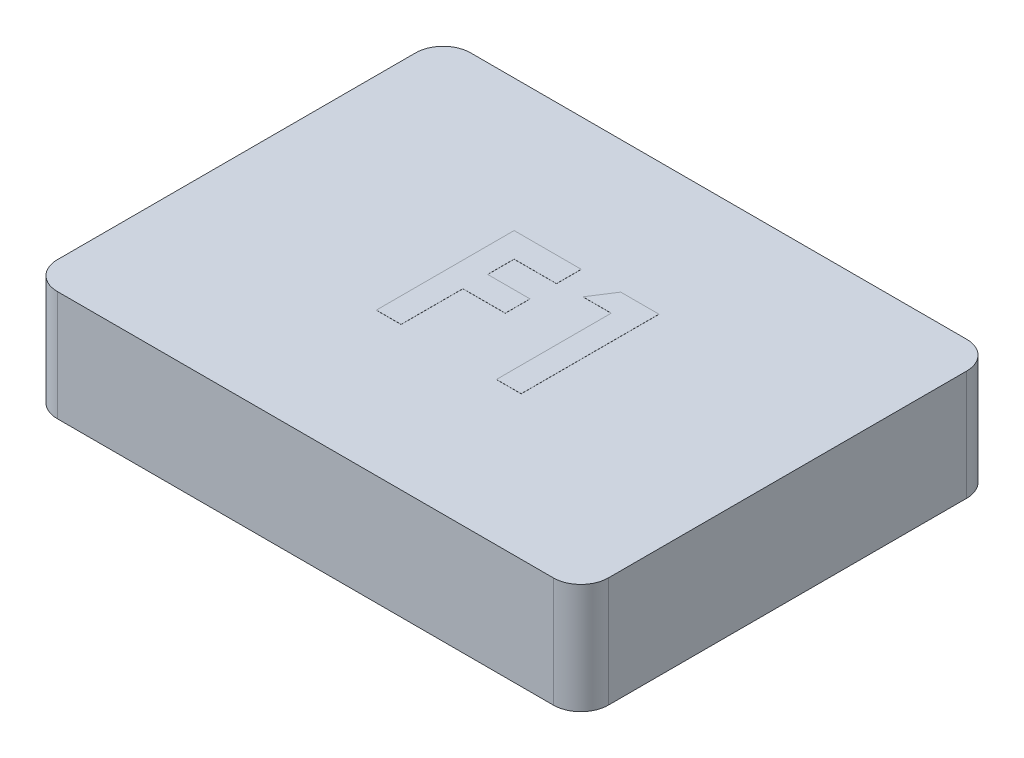
ISO-10303-21;
HEADER;
FILE_DESCRIPTION(('STEP AP214'),'2;1');
FILE_NAME('part.step','',(''),(''),'','','');
FILE_SCHEMA(('AUTOMOTIVE_DESIGN { 1 0 10303 214 1 1 1 1 }'));
ENDSEC;
DATA;
#1=APPLICATION_CONTEXT('core data for automotive mechanical design processes');
#2=APPLICATION_PROTOCOL_DEFINITION('international standard','automotive_design',2000,#1);
#3=PRODUCT_CONTEXT('',#1,'mechanical');
#4=PRODUCT('Part','Part','',(#3));
#5=PRODUCT_RELATED_PRODUCT_CATEGORY('part','',(#4));
#6=PRODUCT_DEFINITION_FORMATION('','',#4);
#7=PRODUCT_DEFINITION_CONTEXT('part definition',#1,'design');
#8=PRODUCT_DEFINITION('design','',#6,#7);
#9=PRODUCT_DEFINITION_SHAPE('','',#8);
#10=(LENGTH_UNIT() NAMED_UNIT(*) SI_UNIT(.MILLI.,.METRE.));
#11=(NAMED_UNIT(*) PLANE_ANGLE_UNIT() SI_UNIT($,.RADIAN.));
#12=(NAMED_UNIT(*) SI_UNIT($,.STERADIAN.) SOLID_ANGLE_UNIT());
#13=UNCERTAINTY_MEASURE_WITH_UNIT(LENGTH_MEASURE(1.E-05),#10,'distance_accuracy_value','');
#14=(GEOMETRIC_REPRESENTATION_CONTEXT(3) GLOBAL_UNCERTAINTY_ASSIGNED_CONTEXT((#13)) GLOBAL_UNIT_ASSIGNED_CONTEXT((#10,
#11,#12)) REPRESENTATION_CONTEXT('',''));
#15=CARTESIAN_POINT('',(0.,0.,0.));
#16=DIRECTION('',(0.,0.,1.));
#17=DIRECTION('',(1.,0.,0.));
#18=AXIS2_PLACEMENT_3D('',#15,#16,#17);
#19=CARTESIAN_POINT('',(0.,2.54,-9.525));
#20=DIRECTION('',(1.,0.,0.));
#21=DIRECTION('',(0.,0.,-1.));
#22=AXIS2_PLACEMENT_3D('',#19,#20,#21);
#23=PLANE('',#22);
#24=DIRECTION('',(0.,0.,1.));
#25=VECTOR('',#24,1.);
#26=CARTESIAN_POINT('',(0.,2.54,-9.525));
#27=LINE('',#26,#25);
#28=CARTESIAN_POINT('',(0.,2.54,-8.89));
#29=VERTEX_POINT('',#28);
#30=CARTESIAN_POINT('',(0.,2.54,-0.635000000000004));
#31=VERTEX_POINT('',#30);
#32=EDGE_CURVE('E392',#29,#31,#27,.T.);
#33=ORIENTED_EDGE('',*,*,#32,.F.);
#34=DIRECTION('',(0.,-1.,0.));
#35=VECTOR('',#34,1.);
#36=CARTESIAN_POINT('',(0.,2.54,-8.89));
#37=LINE('',#36,#35);
#38=CARTESIAN_POINT('',(0.,0.,-8.89));
#39=VERTEX_POINT('',#38);
#40=EDGE_CURVE('E417',#29,#39,#37,.T.);
#41=ORIENTED_EDGE('',*,*,#40,.T.);
#42=DIRECTION('',(0.,0.,1.));
#43=VECTOR('',#42,1.);
#44=CARTESIAN_POINT('',(0.,0.,-9.525));
#45=LINE('',#44,#43);
#46=CARTESIAN_POINT('',(0.,0.,-0.635000000000004));
#47=VERTEX_POINT('',#46);
#48=EDGE_CURVE('E372',#39,#47,#45,.T.);
#49=ORIENTED_EDGE('',*,*,#48,.T.);
#50=DIRECTION('',(0.,-1.,0.));
#51=VECTOR('',#50,1.);
#52=CARTESIAN_POINT('',(0.,2.54,-0.635));
#53=LINE('',#52,#51);
#54=EDGE_CURVE('E405',#47,#31,#53,.F.);
#55=ORIENTED_EDGE('',*,*,#54,.T.);
#56=EDGE_LOOP('',(#33,#41,#49,#55));
#57=FACE_BOUND('',#56,.T.);
#58=ADVANCED_FACE('F33',(#57),#23,.F.);
#59=CARTESIAN_POINT('',(0.,2.54,0.));
#60=DIRECTION('',(0.,0.,-1.));
#61=DIRECTION('',(-1.,0.,0.));
#62=AXIS2_PLACEMENT_3D('',#59,#60,#61);
#63=PLANE('',#62);
#64=DIRECTION('',(1.,0.,0.));
#65=VECTOR('',#64,1.);
#66=CARTESIAN_POINT('',(0.,0.,0.));
#67=LINE('',#66,#65);
#68=CARTESIAN_POINT('',(0.635,0.,0.));
#69=VERTEX_POINT('',#68);
#70=CARTESIAN_POINT('',(12.065,0.,0.));
#71=VERTEX_POINT('',#70);
#72=EDGE_CURVE('E408',#69,#71,#67,.T.);
#73=ORIENTED_EDGE('',*,*,#72,.T.);
#74=DIRECTION('',(0.,-1.,0.));
#75=VECTOR('',#74,1.);
#76=CARTESIAN_POINT('',(12.065,2.54,0.));
#77=LINE('',#76,#75);
#78=CARTESIAN_POINT('',(12.065,2.54,0.));
#79=VERTEX_POINT('',#78);
#80=EDGE_CURVE('E41',#71,#79,#77,.F.);
#81=ORIENTED_EDGE('',*,*,#80,.T.);
#82=DIRECTION('',(1.,0.,0.));
#83=VECTOR('',#82,1.);
#84=CARTESIAN_POINT('',(0.,2.54,0.));
#85=LINE('',#84,#83);
#86=CARTESIAN_POINT('',(0.635,2.54,0.));
#87=VERTEX_POINT('',#86);
#88=EDGE_CURVE('E395',#87,#79,#85,.T.);
#89=ORIENTED_EDGE('',*,*,#88,.F.);
#90=DIRECTION('',(0.,-1.,0.));
#91=VECTOR('',#90,1.);
#92=CARTESIAN_POINT('',(0.635,2.54,0.));
#93=LINE('',#92,#91);
#94=EDGE_CURVE('E446',#87,#69,#93,.T.);
#95=ORIENTED_EDGE('',*,*,#94,.T.);
#96=EDGE_LOOP('',(#73,#81,#89,#95));
#97=FACE_BOUND('',#96,.T.);
#98=ADVANCED_FACE('F451',(#97),#63,.F.);
#99=CARTESIAN_POINT('',(12.7,2.54,0.));
#100=DIRECTION('',(-1.,0.,0.));
#101=DIRECTION('',(0.,0.,1.));
#102=AXIS2_PLACEMENT_3D('',#99,#100,#101);
#103=PLANE('',#102);
#104=DIRECTION('',(0.,0.,-1.));
#105=VECTOR('',#104,1.);
#106=CARTESIAN_POINT('',(12.7,0.,0.));
#107=LINE('',#106,#105);
#108=CARTESIAN_POINT('',(12.7,0.,-0.635));
#109=VERTEX_POINT('',#108);
#110=CARTESIAN_POINT('',(12.7,0.,-8.89));
#111=VERTEX_POINT('',#110);
#112=EDGE_CURVE('E411',#109,#111,#107,.T.);
#113=ORIENTED_EDGE('',*,*,#112,.T.);
#114=DIRECTION('',(0.,-1.,0.));
#115=VECTOR('',#114,1.);
#116=CARTESIAN_POINT('',(12.7,2.54,-8.89));
#117=LINE('',#116,#115);
#118=CARTESIAN_POINT('',(12.7,2.54,-8.89));
#119=VERTEX_POINT('',#118);
#120=EDGE_CURVE('E444',#111,#119,#117,.F.);
#121=ORIENTED_EDGE('',*,*,#120,.T.);
#122=DIRECTION('',(0.,0.,-1.));
#123=VECTOR('',#122,1.);
#124=CARTESIAN_POINT('',(12.7,2.54,0.));
#125=LINE('',#124,#123);
#126=CARTESIAN_POINT('',(12.7,2.54,-0.635));
#127=VERTEX_POINT('',#126);
#128=EDGE_CURVE('E399',#127,#119,#125,.T.);
#129=ORIENTED_EDGE('',*,*,#128,.F.);
#130=DIRECTION('',(0.,-1.,0.));
#131=VECTOR('',#130,1.);
#132=CARTESIAN_POINT('',(12.7,2.54,-0.635));
#133=LINE('',#132,#131);
#134=EDGE_CURVE('E441',#127,#109,#133,.T.);
#135=ORIENTED_EDGE('',*,*,#134,.T.);
#136=EDGE_LOOP('',(#113,#121,#129,#135));
#137=FACE_BOUND('',#136,.T.);
#138=ADVANCED_FACE('F464',(#137),#103,.F.);
#139=CARTESIAN_POINT('',(12.7,2.54,-9.525));
#140=DIRECTION('',(0.,0.,1.));
#141=DIRECTION('',(1.,0.,0.));
#142=AXIS2_PLACEMENT_3D('',#139,#140,#141);
#143=PLANE('',#142);
#144=DIRECTION('',(-1.,0.,0.));
#145=VECTOR('',#144,1.);
#146=CARTESIAN_POINT('',(12.7,0.,-9.525));
#147=LINE('',#146,#145);
#148=CARTESIAN_POINT('',(12.065,0.,-9.525));
#149=VERTEX_POINT('',#148);
#150=CARTESIAN_POINT('',(0.634999999999995,0.,-9.525));
#151=VERTEX_POINT('',#150);
#152=EDGE_CURVE('E396',#149,#151,#147,.T.);
#153=ORIENTED_EDGE('',*,*,#152,.T.);
#154=DIRECTION('',(0.,-1.,0.));
#155=VECTOR('',#154,1.);
#156=CARTESIAN_POINT('',(0.634999999999995,2.54,-9.525));
#157=LINE('',#156,#155);
#158=CARTESIAN_POINT('',(0.634999999999995,2.54,-9.525));
#159=VERTEX_POINT('',#158);
#160=EDGE_CURVE('E431',#151,#159,#157,.F.);
#161=ORIENTED_EDGE('',*,*,#160,.T.);
#162=DIRECTION('',(-1.,0.,0.));
#163=VECTOR('',#162,1.);
#164=CARTESIAN_POINT('',(12.7,2.54,-9.525));
#165=LINE('',#164,#163);
#166=CARTESIAN_POINT('',(12.065,2.54,-9.525));
#167=VERTEX_POINT('',#166);
#168=EDGE_CURVE('E402',#167,#159,#165,.T.);
#169=ORIENTED_EDGE('',*,*,#168,.F.);
#170=DIRECTION('',(0.,-1.,0.));
#171=VECTOR('',#170,1.);
#172=CARTESIAN_POINT('',(12.065,2.54,-9.525));
#173=LINE('',#172,#171);
#174=EDGE_CURVE('E428',#167,#149,#173,.T.);
#175=ORIENTED_EDGE('',*,*,#174,.T.);
#176=EDGE_LOOP('',(#153,#161,#169,#175));
#177=FACE_BOUND('',#176,.T.);
#178=ADVANCED_FACE('F476',(#177),#143,.F.);
#179=CARTESIAN_POINT('',(0.,2.54,0.));
#180=DIRECTION('',(0.,1.,0.));
#181=DIRECTION('',(0.,0.,1.));
#182=AXIS2_PLACEMENT_3D('',#179,#180,#181);
#183=PLANE('',#182);
#184=DIRECTION('',(0.540859777503418,0.,-0.841112775481952));
#185=VECTOR('',#184,1.);
#186=CARTESIAN_POINT('',(6.80101282051282,2.54,-5.94783333333333));
#187=LINE('',#186,#185);
#188=CARTESIAN_POINT('',(6.80101282051282,2.54,-5.94783333333333));
#189=VERTEX_POINT('',#188);
#190=CARTESIAN_POINT('',(7.14128225160256,2.54,-6.477));
#191=VERTEX_POINT('',#190);
#192=EDGE_CURVE('E254',#189,#191,#187,.T.);
#193=ORIENTED_EDGE('',*,*,#192,.T.);
#194=DIRECTION('',(1.,0.,0.));
#195=VECTOR('',#194,1.);
#196=CARTESIAN_POINT('',(7.14128225160256,2.54,-6.477));
#197=LINE('',#196,#195);
#198=CARTESIAN_POINT('',(8.02216666666666,2.54,-6.477));
#199=VERTEX_POINT('',#198);
#200=EDGE_CURVE('E223',#191,#199,#197,.T.);
#201=ORIENTED_EDGE('',*,*,#200,.T.);
#202=DIRECTION('',(0.,0.,1.));
#203=VECTOR('',#202,1.);
#204=CARTESIAN_POINT('',(8.02216666666666,2.54,-6.477));
#205=LINE('',#204,#203);
#206=CARTESIAN_POINT('',(8.02216666666666,2.54,-3.302));
#207=VERTEX_POINT('',#206);
#208=EDGE_CURVE('E257',#199,#207,#205,.T.);
#209=ORIENTED_EDGE('',*,*,#208,.T.);
#210=DIRECTION('',(-1.,0.,0.));
#211=VECTOR('',#210,1.);
#212=CARTESIAN_POINT('',(8.02216666666666,2.54,-3.302));
#213=LINE('',#212,#211);
#214=CARTESIAN_POINT('',(7.45229487179487,2.54,-3.302));
#215=VERTEX_POINT('',#214);
#216=EDGE_CURVE('E259',#207,#215,#213,.T.);
#217=ORIENTED_EDGE('',*,*,#216,.T.);
#218=DIRECTION('',(0.,0.,-1.));
#219=VECTOR('',#218,1.);
#220=CARTESIAN_POINT('',(7.45229487179487,2.54,-3.302));
#221=LINE('',#220,#219);
#222=CARTESIAN_POINT('',(7.45229487179487,2.54,-5.94783333333333));
#223=VERTEX_POINT('',#222);
#224=EDGE_CURVE('E53',#215,#223,#221,.T.);
#225=ORIENTED_EDGE('',*,*,#224,.T.);
#226=DIRECTION('',(-1.,0.,0.));
#227=VECTOR('',#226,1.);
#228=CARTESIAN_POINT('',(7.45229487179487,2.54,-5.94783333333333));
#229=LINE('',#228,#227);
#230=EDGE_CURVE('E48',#223,#189,#229,.T.);
#231=ORIENTED_EDGE('',*,*,#230,.T.);
#232=EDGE_LOOP('',(#193,#201,#209,#217,#225,#231));
#233=FACE_BOUND('',#232,.T.);
#234=DIRECTION('',(0.,0.,-1.));
#235=VECTOR('',#234,1.);
#236=CARTESIAN_POINT('',(4.68434615384615,2.54,-3.302));
#237=LINE('',#236,#235);
#238=CARTESIAN_POINT('',(4.68434615384615,2.54,-3.302));
#239=VERTEX_POINT('',#238);
#240=CARTESIAN_POINT('',(4.68434615384615,2.54,-6.477));
#241=VERTEX_POINT('',#240);
#242=EDGE_CURVE('E263',#239,#241,#237,.T.);
#243=ORIENTED_EDGE('',*,*,#242,.T.);
#244=DIRECTION('',(1.,0.,0.));
#245=VECTOR('',#244,1.);
#246=CARTESIAN_POINT('',(4.68434615384615,2.54,-6.477));
#247=LINE('',#246,#245);
#248=CARTESIAN_POINT('',(6.23114102564102,2.54,-6.477));
#249=VERTEX_POINT('',#248);
#250=EDGE_CURVE('E306',#241,#249,#247,.T.);
#251=ORIENTED_EDGE('',*,*,#250,.T.);
#252=DIRECTION('',(0.,0.,1.));
#253=VECTOR('',#252,1.);
#254=CARTESIAN_POINT('',(6.23114102564102,2.54,-6.477));
#255=LINE('',#254,#253);
#256=CARTESIAN_POINT('',(6.23114102564102,2.54,-5.90712820512821));
#257=VERTEX_POINT('',#256);
#258=EDGE_CURVE('E308',#249,#257,#255,.T.);
#259=ORIENTED_EDGE('',*,*,#258,.T.);
#260=DIRECTION('',(-1.,0.,0.));
#261=VECTOR('',#260,1.);
#262=CARTESIAN_POINT('',(6.23114102564102,2.54,-5.90712820512821));
#263=LINE('',#262,#261);
#264=CARTESIAN_POINT('',(5.25421794871794,2.54,-5.90712820512821));
#265=VERTEX_POINT('',#264);
#266=EDGE_CURVE('E310',#257,#265,#263,.T.);
#267=ORIENTED_EDGE('',*,*,#266,.T.);
#268=DIRECTION('',(0.,0.,1.));
#269=VECTOR('',#268,1.);
#270=CARTESIAN_POINT('',(5.25421794871794,2.54,-5.90712820512821));
#271=LINE('',#270,#269);
#272=CARTESIAN_POINT('',(5.25421794871794,2.54,-5.29655128205128));
#273=VERTEX_POINT('',#272);
#274=EDGE_CURVE('E312',#265,#273,#271,.T.);
#275=ORIENTED_EDGE('',*,*,#274,.T.);
#276=DIRECTION('',(1.,0.,0.));
#277=VECTOR('',#276,1.);
#278=CARTESIAN_POINT('',(5.25421794871794,2.54,-5.29655128205128));
#279=LINE('',#278,#277);
#280=CARTESIAN_POINT('',(6.23114102564102,2.54,-5.29655128205128));
#281=VERTEX_POINT('',#280);
#282=EDGE_CURVE('E314',#273,#281,#279,.T.);
#283=ORIENTED_EDGE('',*,*,#282,.T.);
#284=DIRECTION('',(0.,0.,1.));
#285=VECTOR('',#284,1.);
#286=CARTESIAN_POINT('',(6.23114102564102,2.54,-5.29655128205128));
#287=LINE('',#286,#285);
#288=CARTESIAN_POINT('',(6.23114102564102,2.54,-4.72667948717949));
#289=VERTEX_POINT('',#288);
#290=EDGE_CURVE('E316',#281,#289,#287,.T.);
#291=ORIENTED_EDGE('',*,*,#290,.T.);
#292=DIRECTION('',(-1.,0.,0.));
#293=VECTOR('',#292,1.);
#294=CARTESIAN_POINT('',(6.23114102564102,2.54,-4.72667948717949));
#295=LINE('',#294,#293);
#296=CARTESIAN_POINT('',(5.25421794871794,2.54,-4.72667948717949));
#297=VERTEX_POINT('',#296);
#298=EDGE_CURVE('E318',#289,#297,#295,.T.);
#299=ORIENTED_EDGE('',*,*,#298,.T.);
#300=DIRECTION('',(0.,0.,1.));
#301=VECTOR('',#300,1.);
#302=CARTESIAN_POINT('',(5.25421794871794,2.54,-4.72667948717949));
#303=LINE('',#302,#301);
#304=CARTESIAN_POINT('',(5.25421794871794,2.54,-3.302));
#305=VERTEX_POINT('',#304);
#306=EDGE_CURVE('E320',#297,#305,#303,.T.);
#307=ORIENTED_EDGE('',*,*,#306,.T.);
#308=DIRECTION('',(-1.,0.,0.));
#309=VECTOR('',#308,1.);
#310=CARTESIAN_POINT('',(5.25421794871794,2.54,-3.302));
#311=LINE('',#310,#309);
#312=EDGE_CURVE('E277',#305,#239,#311,.T.);
#313=ORIENTED_EDGE('',*,*,#312,.T.);
#314=EDGE_LOOP('',(#243,#251,#259,#267,#275,#283,#291,#299,#307,#313));
#315=FACE_BOUND('',#314,.T.);
#316=ORIENTED_EDGE('',*,*,#168,.T.);
#317=CARTESIAN_POINT('',(0.634999999999995,2.54,-8.89));
#318=DIRECTION('',(0.,1.,0.));
#319=DIRECTION('',(0.,0.,1.));
#320=AXIS2_PLACEMENT_3D('',#317,#318,#319);
#321=CIRCLE('',#320,0.635);
#322=EDGE_CURVE('E439',#159,#29,#321,.T.);
#323=ORIENTED_EDGE('',*,*,#322,.T.);
#324=ORIENTED_EDGE('',*,*,#32,.T.);
#325=CARTESIAN_POINT('',(0.635,2.54,-0.635));
#326=DIRECTION('',(0.,1.,0.));
#327=DIRECTION('',(0.,0.,1.));
#328=AXIS2_PLACEMENT_3D('',#325,#326,#327);
#329=CIRCLE('',#328,0.635);
#330=EDGE_CURVE('E433',#31,#87,#329,.T.);
#331=ORIENTED_EDGE('',*,*,#330,.T.);
#332=ORIENTED_EDGE('',*,*,#88,.T.);
#333=CARTESIAN_POINT('',(12.065,2.54,-0.635));
#334=DIRECTION('',(0.,1.,0.));
#335=DIRECTION('',(0.,0.,1.));
#336=AXIS2_PLACEMENT_3D('',#333,#334,#335);
#337=CIRCLE('',#336,0.635);
#338=EDGE_CURVE('E435',#79,#127,#337,.T.);
#339=ORIENTED_EDGE('',*,*,#338,.T.);
#340=ORIENTED_EDGE('',*,*,#128,.T.);
#341=CARTESIAN_POINT('',(12.065,2.54,-8.89));
#342=DIRECTION('',(0.,1.,0.));
#343=DIRECTION('',(0.,0.,1.));
#344=AXIS2_PLACEMENT_3D('',#341,#342,#343);
#345=CIRCLE('',#344,0.635);
#346=EDGE_CURVE('E437',#119,#167,#345,.T.);
#347=ORIENTED_EDGE('',*,*,#346,.T.);
#348=EDGE_LOOP('',(#316,#323,#324,#331,#332,#339,#340,#347));
#349=FACE_BOUND('',#348,.T.);
#350=ADVANCED_FACE('F457',(#233,#315,#349),#183,.T.);
#351=CARTESIAN_POINT('',(0.,0.,0.));
#352=DIRECTION('',(0.,1.,0.));
#353=DIRECTION('',(0.,0.,1.));
#354=AXIS2_PLACEMENT_3D('',#351,#352,#353);
#355=PLANE('',#354);
#356=DIRECTION('',(-1.,0.,0.));
#357=VECTOR('',#356,1.);
#358=CARTESIAN_POINT('',(12.7,0.,-8.89));
#359=LINE('',#358,#357);
#360=CARTESIAN_POINT('',(12.065,0.,-8.89));
#361=VERTEX_POINT('',#360);
#362=CARTESIAN_POINT('',(0.634999999999995,0.,-8.89));
#363=VERTEX_POINT('',#362);
#364=EDGE_CURVE('E360',#361,#363,#359,.T.);
#365=ORIENTED_EDGE('',*,*,#364,.T.);
#366=DIRECTION('',(0.,0.,1.));
#367=VECTOR('',#366,1.);
#368=CARTESIAN_POINT('',(0.634999999999995,0.,-9.525));
#369=LINE('',#368,#367);
#370=CARTESIAN_POINT('',(0.635,0.,-0.635));
#371=VERTEX_POINT('',#370);
#372=EDGE_CURVE('E355',#363,#371,#369,.T.);
#373=ORIENTED_EDGE('',*,*,#372,.T.);
#374=DIRECTION('',(1.,0.,0.));
#375=VECTOR('',#374,1.);
#376=CARTESIAN_POINT('',(0.,0.,-0.635));
#377=LINE('',#376,#375);
#378=CARTESIAN_POINT('',(12.065,0.,-0.635));
#379=VERTEX_POINT('',#378);
#380=EDGE_CURVE('E384',#371,#379,#377,.T.);
#381=ORIENTED_EDGE('',*,*,#380,.T.);
#382=DIRECTION('',(0.,0.,-1.));
#383=VECTOR('',#382,1.);
#384=CARTESIAN_POINT('',(12.065,0.,0.));
#385=LINE('',#384,#383);
#386=EDGE_CURVE('E387',#379,#361,#385,.T.);
#387=ORIENTED_EDGE('',*,*,#386,.T.);
#388=EDGE_LOOP('',(#365,#373,#381,#387));
#389=FACE_BOUND('',#388,.T.);
#390=ORIENTED_EDGE('',*,*,#48,.F.);
#391=CARTESIAN_POINT('',(0.634999999999995,0.,-8.89));
#392=DIRECTION('',(0.,1.,0.));
#393=DIRECTION('',(0.,0.,1.));
#394=AXIS2_PLACEMENT_3D('',#391,#392,#393);
#395=CIRCLE('',#394,0.635);
#396=EDGE_CURVE('E426',#39,#151,#395,.F.);
#397=ORIENTED_EDGE('',*,*,#396,.T.);
#398=ORIENTED_EDGE('',*,*,#152,.F.);
#399=CARTESIAN_POINT('',(12.065,0.,-8.89));
#400=DIRECTION('',(0.,1.,0.));
#401=DIRECTION('',(0.,0.,1.));
#402=AXIS2_PLACEMENT_3D('',#399,#400,#401);
#403=CIRCLE('',#402,0.635);
#404=EDGE_CURVE('E424',#149,#111,#403,.F.);
#405=ORIENTED_EDGE('',*,*,#404,.T.);
#406=ORIENTED_EDGE('',*,*,#112,.F.);
#407=CARTESIAN_POINT('',(12.065,0.,-0.635));
#408=DIRECTION('',(0.,1.,0.));
#409=DIRECTION('',(0.,0.,1.));
#410=AXIS2_PLACEMENT_3D('',#407,#408,#409);
#411=CIRCLE('',#410,0.635);
#412=EDGE_CURVE('E422',#109,#71,#411,.F.);
#413=ORIENTED_EDGE('',*,*,#412,.T.);
#414=ORIENTED_EDGE('',*,*,#72,.F.);
#415=CARTESIAN_POINT('',(0.635,0.,-0.635));
#416=DIRECTION('',(0.,1.,0.));
#417=DIRECTION('',(0.,0.,1.));
#418=AXIS2_PLACEMENT_3D('',#415,#416,#417);
#419=CIRCLE('',#418,0.635);
#420=EDGE_CURVE('E420',#69,#47,#419,.F.);
#421=ORIENTED_EDGE('',*,*,#420,.T.);
#422=EDGE_LOOP('',(#390,#397,#398,#405,#406,#413,#414,#421));
#423=FACE_BOUND('',#422,.T.);
#424=ADVANCED_FACE('F468',(#389,#423),#355,.F.);
#425=CARTESIAN_POINT('',(0.634999999999995,2.54,-8.89));
#426=DIRECTION('',(0.,-1.,0.));
#427=DIRECTION('',(0.,0.,-1.));
#428=AXIS2_PLACEMENT_3D('',#425,#426,#427);
#429=CYLINDRICAL_SURFACE('',#428,0.635);
#430=ORIENTED_EDGE('',*,*,#322,.F.);
#431=ORIENTED_EDGE('',*,*,#160,.F.);
#432=ORIENTED_EDGE('',*,*,#396,.F.);
#433=ORIENTED_EDGE('',*,*,#40,.F.);
#434=EDGE_LOOP('',(#430,#431,#432,#433));
#435=FACE_BOUND('',#434,.T.);
#436=ADVANCED_FACE('F482',(#435),#429,.T.);
#437=CARTESIAN_POINT('',(12.065,2.54,-8.89));
#438=DIRECTION('',(0.,-1.,0.));
#439=DIRECTION('',(0.,0.,-1.));
#440=AXIS2_PLACEMENT_3D('',#437,#438,#439);
#441=CYLINDRICAL_SURFACE('',#440,0.635);
#442=ORIENTED_EDGE('',*,*,#346,.F.);
#443=ORIENTED_EDGE('',*,*,#120,.F.);
#444=ORIENTED_EDGE('',*,*,#404,.F.);
#445=ORIENTED_EDGE('',*,*,#174,.F.);
#446=EDGE_LOOP('',(#442,#443,#444,#445));
#447=FACE_BOUND('',#446,.T.);
#448=ADVANCED_FACE('F473',(#447),#441,.T.);
#449=CARTESIAN_POINT('',(12.065,2.54,-0.635));
#450=DIRECTION('',(0.,-1.,0.));
#451=DIRECTION('',(0.,0.,-1.));
#452=AXIS2_PLACEMENT_3D('',#449,#450,#451);
#453=CYLINDRICAL_SURFACE('',#452,0.635);
#454=ORIENTED_EDGE('',*,*,#338,.F.);
#455=ORIENTED_EDGE('',*,*,#80,.F.);
#456=ORIENTED_EDGE('',*,*,#412,.F.);
#457=ORIENTED_EDGE('',*,*,#134,.F.);
#458=EDGE_LOOP('',(#454,#455,#456,#457));
#459=FACE_BOUND('',#458,.T.);
#460=ADVANCED_FACE('F461',(#459),#453,.T.);
#461=CARTESIAN_POINT('',(0.635,2.54,-0.635));
#462=DIRECTION('',(0.,-1.,0.));
#463=DIRECTION('',(0.,0.,-1.));
#464=AXIS2_PLACEMENT_3D('',#461,#462,#463);
#465=CYLINDRICAL_SURFACE('',#464,0.635);
#466=ORIENTED_EDGE('',*,*,#330,.F.);
#467=ORIENTED_EDGE('',*,*,#54,.F.);
#468=ORIENTED_EDGE('',*,*,#420,.F.);
#469=ORIENTED_EDGE('',*,*,#94,.F.);
#470=EDGE_LOOP('',(#466,#467,#468,#469));
#471=FACE_BOUND('',#470,.T.);
#472=ADVANCED_FACE('F35',(#471),#465,.T.);
#473=CARTESIAN_POINT('',(0.634999999999995,2.54,-9.525));
#474=DIRECTION('',(1.,0.,0.));
#475=DIRECTION('',(0.,0.,-1.));
#476=AXIS2_PLACEMENT_3D('',#473,#474,#475);
#477=PLANE('',#476);
#478=DIRECTION('',(0.,0.,1.));
#479=VECTOR('',#478,1.);
#480=CARTESIAN_POINT('',(0.634999999999995,1.905,-9.525));
#481=LINE('',#480,#479);
#482=CARTESIAN_POINT('',(0.634999999999995,1.905,-8.89));
#483=VERTEX_POINT('',#482);
#484=CARTESIAN_POINT('',(0.635,1.905,-0.635));
#485=VERTEX_POINT('',#484);
#486=EDGE_CURVE('E356',#483,#485,#481,.T.);
#487=ORIENTED_EDGE('',*,*,#486,.T.);
#488=DIRECTION('',(0.,1.,0.));
#489=VECTOR('',#488,1.);
#490=CARTESIAN_POINT('',(0.635,2.54,-0.635));
#491=LINE('',#490,#489);
#492=EDGE_CURVE('E365',#371,#485,#491,.T.);
#493=ORIENTED_EDGE('',*,*,#492,.F.);
#494=ORIENTED_EDGE('',*,*,#372,.F.);
#495=DIRECTION('',(0.,1.,0.));
#496=VECTOR('',#495,1.);
#497=CARTESIAN_POINT('',(0.634999999999995,2.54,-8.89));
#498=LINE('',#497,#496);
#499=EDGE_CURVE('E361',#363,#483,#498,.T.);
#500=ORIENTED_EDGE('',*,*,#499,.T.);
#501=EDGE_LOOP('',(#487,#493,#494,#500));
#502=FACE_BOUND('',#501,.T.);
#503=ADVANCED_FACE('F487',(#502),#477,.T.);
#504=CARTESIAN_POINT('',(0.,2.54,-0.635));
#505=DIRECTION('',(0.,0.,-1.));
#506=DIRECTION('',(-1.,0.,0.));
#507=AXIS2_PLACEMENT_3D('',#504,#505,#506);
#508=PLANE('',#507);
#509=ORIENTED_EDGE('',*,*,#380,.F.);
#510=ORIENTED_EDGE('',*,*,#492,.T.);
#511=DIRECTION('',(1.,0.,0.));
#512=VECTOR('',#511,1.);
#513=CARTESIAN_POINT('',(0.,1.905,-0.635));
#514=LINE('',#513,#512);
#515=CARTESIAN_POINT('',(12.065,1.905,-0.635));
#516=VERTEX_POINT('',#515);
#517=EDGE_CURVE('E359',#485,#516,#514,.T.);
#518=ORIENTED_EDGE('',*,*,#517,.T.);
#519=DIRECTION('',(0.,1.,0.));
#520=VECTOR('',#519,1.);
#521=CARTESIAN_POINT('',(12.065,2.54,-0.635));
#522=LINE('',#521,#520);
#523=EDGE_CURVE('E369',#379,#516,#522,.T.);
#524=ORIENTED_EDGE('',*,*,#523,.F.);
#525=EDGE_LOOP('',(#509,#510,#518,#524));
#526=FACE_BOUND('',#525,.T.);
#527=ADVANCED_FACE('F492',(#526),#508,.T.);
#528=CARTESIAN_POINT('',(12.065,2.54,0.));
#529=DIRECTION('',(-1.,0.,0.));
#530=DIRECTION('',(0.,0.,1.));
#531=AXIS2_PLACEMENT_3D('',#528,#529,#530);
#532=PLANE('',#531);
#533=ORIENTED_EDGE('',*,*,#386,.F.);
#534=ORIENTED_EDGE('',*,*,#523,.T.);
#535=DIRECTION('',(0.,0.,-1.));
#536=VECTOR('',#535,1.);
#537=CARTESIAN_POINT('',(12.065,1.905,0.));
#538=LINE('',#537,#536);
#539=CARTESIAN_POINT('',(12.065,1.905,-8.89));
#540=VERTEX_POINT('',#539);
#541=EDGE_CURVE('E375',#516,#540,#538,.T.);
#542=ORIENTED_EDGE('',*,*,#541,.T.);
#543=DIRECTION('',(0.,1.,0.));
#544=VECTOR('',#543,1.);
#545=CARTESIAN_POINT('',(12.065,2.54,-8.89));
#546=LINE('',#545,#544);
#547=EDGE_CURVE('E364',#361,#540,#546,.T.);
#548=ORIENTED_EDGE('',*,*,#547,.F.);
#549=EDGE_LOOP('',(#533,#534,#542,#548));
#550=FACE_BOUND('',#549,.T.);
#551=ADVANCED_FACE('F545',(#550),#532,.T.);
#552=CARTESIAN_POINT('',(12.7,2.54,-8.89));
#553=DIRECTION('',(0.,0.,1.));
#554=DIRECTION('',(1.,0.,0.));
#555=AXIS2_PLACEMENT_3D('',#552,#553,#554);
#556=PLANE('',#555);
#557=ORIENTED_EDGE('',*,*,#364,.F.);
#558=ORIENTED_EDGE('',*,*,#547,.T.);
#559=DIRECTION('',(-1.,0.,0.));
#560=VECTOR('',#559,1.);
#561=CARTESIAN_POINT('',(12.7,1.905,-8.89));
#562=LINE('',#561,#560);
#563=EDGE_CURVE('E368',#540,#483,#562,.T.);
#564=ORIENTED_EDGE('',*,*,#563,.T.);
#565=ORIENTED_EDGE('',*,*,#499,.F.);
#566=EDGE_LOOP('',(#557,#558,#564,#565));
#567=FACE_BOUND('',#566,.T.);
#568=ADVANCED_FACE('F555',(#567),#556,.T.);
#569=CARTESIAN_POINT('',(0.,1.905,0.));
#570=DIRECTION('',(0.,1.,0.));
#571=DIRECTION('',(0.,0.,1.));
#572=AXIS2_PLACEMENT_3D('',#569,#570,#571);
#573=PLANE('',#572);
#574=CARTESIAN_POINT('',(6.35,1.905,-4.7625));
#575=DIRECTION('',(0.,1.,0.));
#576=DIRECTION('',(0.,0.,1.));
#577=AXIS2_PLACEMENT_3D('',#574,#575,#576);
#578=CIRCLE('',#577,2.54);
#579=CARTESIAN_POINT('',(6.35,1.905,-2.2225));
#580=VERTEX_POINT('',#579);
#581=EDGE_CURVE('E11',#580,#580,#578,.F.);
#582=ORIENTED_EDGE('',*,*,#581,.F.);
#583=EDGE_LOOP('',(#582));
#584=FACE_BOUND('',#583,.T.);
#585=ORIENTED_EDGE('',*,*,#563,.F.);
#586=ORIENTED_EDGE('',*,*,#541,.F.);
#587=ORIENTED_EDGE('',*,*,#517,.F.);
#588=ORIENTED_EDGE('',*,*,#486,.F.);
#589=EDGE_LOOP('',(#585,#586,#587,#588));
#590=FACE_BOUND('',#589,.T.);
#591=ADVANCED_FACE('F565',(#584,#590),#573,.F.);
#592=CARTESIAN_POINT('',(6.35,-7.18420489685532,-4.7625));
#593=DIRECTION('',(0.,1.,0.));
#594=DIRECTION('',(0.,0.,1.));
#595=AXIS2_PLACEMENT_3D('',#592,#593,#594);
#596=CYLINDRICAL_SURFACE('',#595,2.54);
#597=CARTESIAN_POINT('',(6.35,0.,-4.7625));
#598=DIRECTION('',(0.,1.,0.));
#599=DIRECTION('',(0.,0.,1.));
#600=AXIS2_PLACEMENT_3D('',#597,#598,#599);
#601=CIRCLE('',#600,2.54);
#602=CARTESIAN_POINT('',(6.35,0.,-2.2225));
#603=VERTEX_POINT('',#602);
#604=EDGE_CURVE('E326',#603,#603,#601,.T.);
#605=CARTESIAN_POINT('',(6.35,0.,-2.2225));
#606=CARTESIAN_POINT('',(6.35,0.0198437499999991,-2.2225));
#607=CARTESIAN_POINT('',(6.35,0.0396874999999989,-2.2225));
#608=CARTESIAN_POINT('',(6.35,0.079374999999999,-2.2225));
#609=CARTESIAN_POINT('',(6.35,0.0992187499999992,-2.2225));
#610=CARTESIAN_POINT('',(6.35,0.138906249999999,-2.2225));
#611=CARTESIAN_POINT('',(6.35,0.158749999999999,-2.2225));
#612=CARTESIAN_POINT('',(6.35,0.198437499999999,-2.2225));
#613=CARTESIAN_POINT('',(6.35,0.218281249999999,-2.2225));
#614=CARTESIAN_POINT('',(6.35,0.25796875,-2.2225));
#615=CARTESIAN_POINT('',(6.35,0.277812499999999,-2.2225));
#616=CARTESIAN_POINT('',(6.35,0.317499999999999,-2.2225));
#617=CARTESIAN_POINT('',(6.35,0.337343749999999,-2.2225));
#618=CARTESIAN_POINT('',(6.35,0.377031249999999,-2.2225));
#619=CARTESIAN_POINT('',(6.35,0.396874999999999,-2.2225));
#620=CARTESIAN_POINT('',(6.35,0.436562499999999,-2.2225));
#621=CARTESIAN_POINT('',(6.35,0.456406249999999,-2.2225));
#622=CARTESIAN_POINT('',(6.35,0.496093749999999,-2.2225));
#623=CARTESIAN_POINT('',(6.35,0.515937499999999,-2.2225));
#624=CARTESIAN_POINT('',(6.35,0.555624999999999,-2.2225));
#625=CARTESIAN_POINT('',(6.35,0.575468749999999,-2.2225));
#626=CARTESIAN_POINT('',(6.35,0.615156249999999,-2.2225));
#627=CARTESIAN_POINT('',(6.35,0.634999999999999,-2.2225));
#628=CARTESIAN_POINT('',(6.35,0.674687499999998,-2.2225));
#629=CARTESIAN_POINT('',(6.35,0.694531249999998,-2.2225));
#630=CARTESIAN_POINT('',(6.35,0.734218749999998,-2.2225));
#631=CARTESIAN_POINT('',(6.35,0.754062499999998,-2.2225));
#632=CARTESIAN_POINT('',(6.35,0.793749999999998,-2.2225));
#633=CARTESIAN_POINT('',(6.35,0.813593749999999,-2.2225));
#634=CARTESIAN_POINT('',(6.35,0.853281249999999,-2.2225));
#635=CARTESIAN_POINT('',(6.35,0.873124999999999,-2.2225));
#636=CARTESIAN_POINT('',(6.35,0.912812499999999,-2.2225));
#637=CARTESIAN_POINT('',(6.35,0.932656249999999,-2.2225));
#638=CARTESIAN_POINT('',(6.35,0.972343749999998,-2.2225));
#639=CARTESIAN_POINT('',(6.35,0.992187499999998,-2.2225));
#640=CARTESIAN_POINT('',(6.35,1.031875,-2.2225));
#641=CARTESIAN_POINT('',(6.35,1.05171875,-2.2225));
#642=CARTESIAN_POINT('',(6.35,1.09140625,-2.2225));
#643=CARTESIAN_POINT('',(6.35,1.11125,-2.2225));
#644=CARTESIAN_POINT('',(6.35,1.1509375,-2.2225));
#645=CARTESIAN_POINT('',(6.35,1.17078125,-2.2225));
#646=CARTESIAN_POINT('',(6.35,1.21046875,-2.2225));
#647=CARTESIAN_POINT('',(6.35,1.2303125,-2.2225));
#648=CARTESIAN_POINT('',(6.35,1.27,-2.2225));
#649=CARTESIAN_POINT('',(6.35,1.28984375,-2.2225));
#650=CARTESIAN_POINT('',(6.35,1.32953125,-2.2225));
#651=CARTESIAN_POINT('',(6.35,1.349375,-2.2225));
#652=CARTESIAN_POINT('',(6.35,1.3890625,-2.2225));
#653=CARTESIAN_POINT('',(6.35,1.40890625,-2.2225));
#654=CARTESIAN_POINT('',(6.35,1.44859375,-2.2225));
#655=CARTESIAN_POINT('',(6.35,1.4684375,-2.2225));
#656=CARTESIAN_POINT('',(6.35,1.508125,-2.2225));
#657=CARTESIAN_POINT('',(6.35,1.52796875,-2.2225));
#658=CARTESIAN_POINT('',(6.35,1.56765625,-2.2225));
#659=CARTESIAN_POINT('',(6.35,1.5875,-2.2225));
#660=CARTESIAN_POINT('',(6.35,1.6271875,-2.2225));
#661=CARTESIAN_POINT('',(6.35,1.64703125,-2.2225));
#662=CARTESIAN_POINT('',(6.35,1.68671875,-2.2225));
#663=CARTESIAN_POINT('',(6.35,1.7065625,-2.2225));
#664=CARTESIAN_POINT('',(6.35,1.74625,-2.2225));
#665=CARTESIAN_POINT('',(6.35,1.76609375,-2.2225));
#666=CARTESIAN_POINT('',(6.35,1.80578125,-2.2225));
#667=CARTESIAN_POINT('',(6.35,1.825625,-2.2225));
#668=CARTESIAN_POINT('',(6.35,1.8653125,-2.2225));
#669=CARTESIAN_POINT('',(6.35,1.88515625,-2.2225));
#670=CARTESIAN_POINT('',(6.35,1.905,-2.2225));
#671=B_SPLINE_CURVE_WITH_KNOTS('',3,(#605,#606,#607,#608,#609,#610,#611,#612,#613,#614,#615,
#616,#617,#618,#619,#620,#621,#622,#623,#624,#625,#626,#627,#628,#629,#630,#631,#632,#633,#634,
#635,#636,#637,#638,#639,#640,#641,#642,#643,#644,#645,#646,#647,#648,#649,#650,#651,#652,#653,
#654,#655,#656,#657,#658,#659,#660,#661,#662,#663,#664,#665,#666,#667,#668,#669,#670),
.UNSPECIFIED.,.F.,.F.,(4,2,2,2,2,2,2,2,2,2,2,2,2,2,2,2,2,2,2,2,2,2,2,2,2,2,2,2,2,2,2,2,4),(0.,
0.0595312499999997,0.1190625,0.17859375,0.238125,0.29765625,0.3571875,0.41671875,0.47625,
0.53578125,0.5953125,0.654843749999999,0.714374999999999,0.773906249999999,0.8334375,0.89296875,
0.952499999999999,1.01203125,1.0715625,1.13109375,1.190625,1.25015625,1.3096875,1.36921875,
1.42875,1.48828125,1.5478125,1.60734375,1.666875,1.72640625,1.7859375,1.84546875,1.905),.UNSPECIFIED.);
#672=EDGE_CURVE('BSEAM575',#603,#580,#671,.T.);
#673=ORIENTED_EDGE('',*,*,#604,.T.);
#674=ORIENTED_EDGE('',*,*,#581,.T.);
#675=ORIENTED_EDGE('',*,*,#672,.T.);
#676=ORIENTED_EDGE('',*,*,#672,.F.);
#677=EDGE_LOOP('',(#673,#675,#674,#676));
#678=FACE_BOUND('',#677,.T.);
#679=ADVANCED_FACE('F575',(#678),#596,.T.);
#680=CARTESIAN_POINT('',(0.,0.,0.));
#681=DIRECTION('',(0.,1.,0.));
#682=DIRECTION('',(0.,0.,1.));
#683=AXIS2_PLACEMENT_3D('',#680,#681,#682);
#684=PLANE('',#683);
#685=ORIENTED_EDGE('',*,*,#604,.F.);
#686=EDGE_LOOP('',(#685));
#687=FACE_BOUND('',#686,.T.);
#688=ADVANCED_FACE('F585',(#687),#684,.F.);
#689=CARTESIAN_POINT('',(4.68434615384615,2.54254,-3.302));
#690=DIRECTION('',(-1.,0.,0.));
#691=DIRECTION('',(0.,0.,1.));
#692=AXIS2_PLACEMENT_3D('',#689,#690,#691);
#693=PLANE('',#692);
#694=ORIENTED_EDGE('',*,*,#242,.F.);
#695=DIRECTION('',(0.,-1.,0.));
#696=VECTOR('',#695,1.);
#697=CARTESIAN_POINT('',(4.68434615384615,2.54254,-3.302));
#698=LINE('',#697,#696);
#699=CARTESIAN_POINT('',(4.68434615384615,2.54254,-3.302));
#700=VERTEX_POINT('',#699);
#701=EDGE_CURVE('E323',#700,#239,#698,.T.);
#702=ORIENTED_EDGE('',*,*,#701,.F.);
#703=DIRECTION('',(0.,0.,-1.));
#704=VECTOR('',#703,1.);
#705=CARTESIAN_POINT('',(4.68434615384615,2.54254,-3.302));
#706=LINE('',#705,#704);
#707=CARTESIAN_POINT('',(4.68434615384615,2.54254,-6.477));
#708=VERTEX_POINT('',#707);
#709=EDGE_CURVE('E273',#700,#708,#706,.T.);
#710=ORIENTED_EDGE('',*,*,#709,.T.);
#711=DIRECTION('',(0.,-1.,0.));
#712=VECTOR('',#711,1.);
#713=CARTESIAN_POINT('',(4.68434615384615,2.54254,-6.477));
#714=LINE('',#713,#712);
#715=EDGE_CURVE('E304',#708,#241,#714,.T.);
#716=ORIENTED_EDGE('',*,*,#715,.T.);
#717=EDGE_LOOP('',(#694,#702,#710,#716));
#718=FACE_BOUND('',#717,.T.);
#719=ADVANCED_FACE('F595',(#718),#693,.T.);
#720=CARTESIAN_POINT('',(5.25421794871794,2.54254,-3.302));
#721=DIRECTION('',(0.,0.,1.));
#722=DIRECTION('',(1.,0.,0.));
#723=AXIS2_PLACEMENT_3D('',#720,#721,#722);
#724=PLANE('',#723);
#725=ORIENTED_EDGE('',*,*,#312,.F.);
#726=DIRECTION('',(0.,-1.,0.));
#727=VECTOR('',#726,1.);
#728=CARTESIAN_POINT('',(5.25421794871794,2.54254,-3.302));
#729=LINE('',#728,#727);
#730=CARTESIAN_POINT('',(5.25421794871794,2.54254,-3.302));
#731=VERTEX_POINT('',#730);
#732=EDGE_CURVE('E327',#731,#305,#729,.T.);
#733=ORIENTED_EDGE('',*,*,#732,.F.);
#734=DIRECTION('',(-1.,0.,0.));
#735=VECTOR('',#734,1.);
#736=CARTESIAN_POINT('',(5.25421794871794,2.54254,-3.302));
#737=LINE('',#736,#735);
#738=EDGE_CURVE('E301',#731,#700,#737,.T.);
#739=ORIENTED_EDGE('',*,*,#738,.T.);
#740=ORIENTED_EDGE('',*,*,#701,.T.);
#741=EDGE_LOOP('',(#725,#733,#739,#740));
#742=FACE_BOUND('',#741,.T.);
#743=ADVANCED_FACE('F610',(#742),#724,.T.);
#744=CARTESIAN_POINT('',(5.25421794871794,2.54254,-4.72667948717949));
#745=DIRECTION('',(1.,0.,0.));
#746=DIRECTION('',(0.,0.,-1.));
#747=AXIS2_PLACEMENT_3D('',#744,#745,#746);
#748=PLANE('',#747);
#749=ORIENTED_EDGE('',*,*,#306,.F.);
#750=DIRECTION('',(0.,-1.,0.));
#751=VECTOR('',#750,1.);
#752=CARTESIAN_POINT('',(5.25421794871794,2.54254,-4.72667948717949));
#753=LINE('',#752,#751);
#754=CARTESIAN_POINT('',(5.25421794871794,2.54254,-4.72667948717949));
#755=VERTEX_POINT('',#754);
#756=EDGE_CURVE('E330',#755,#297,#753,.T.);
#757=ORIENTED_EDGE('',*,*,#756,.F.);
#758=DIRECTION('',(0.,0.,1.));
#759=VECTOR('',#758,1.);
#760=CARTESIAN_POINT('',(5.25421794871794,2.54254,-4.72667948717949));
#761=LINE('',#760,#759);
#762=EDGE_CURVE('E298',#755,#731,#761,.T.);
#763=ORIENTED_EDGE('',*,*,#762,.T.);
#764=ORIENTED_EDGE('',*,*,#732,.T.);
#765=EDGE_LOOP('',(#749,#757,#763,#764));
#766=FACE_BOUND('',#765,.T.);
#767=ADVANCED_FACE('F620',(#766),#748,.T.);
#768=CARTESIAN_POINT('',(6.23114102564102,2.54254,-4.72667948717949));
#769=DIRECTION('',(0.,0.,1.));
#770=DIRECTION('',(1.,0.,0.));
#771=AXIS2_PLACEMENT_3D('',#768,#769,#770);
#772=PLANE('',#771);
#773=ORIENTED_EDGE('',*,*,#298,.F.);
#774=DIRECTION('',(0.,-1.,0.));
#775=VECTOR('',#774,1.);
#776=CARTESIAN_POINT('',(6.23114102564102,2.54254,-4.72667948717949));
#777=LINE('',#776,#775);
#778=CARTESIAN_POINT('',(6.23114102564102,2.54254,-4.72667948717949));
#779=VERTEX_POINT('',#778);
#780=EDGE_CURVE('E333',#779,#289,#777,.T.);
#781=ORIENTED_EDGE('',*,*,#780,.F.);
#782=DIRECTION('',(-1.,0.,0.));
#783=VECTOR('',#782,1.);
#784=CARTESIAN_POINT('',(6.23114102564102,2.54254,-4.72667948717949));
#785=LINE('',#784,#783);
#786=EDGE_CURVE('E295',#779,#755,#785,.T.);
#787=ORIENTED_EDGE('',*,*,#786,.T.);
#788=ORIENTED_EDGE('',*,*,#756,.T.);
#789=EDGE_LOOP('',(#773,#781,#787,#788));
#790=FACE_BOUND('',#789,.T.);
#791=ADVANCED_FACE('F630',(#790),#772,.T.);
#792=CARTESIAN_POINT('',(6.23114102564102,2.54254,-5.29655128205128));
#793=DIRECTION('',(1.,0.,0.));
#794=DIRECTION('',(0.,0.,-1.));
#795=AXIS2_PLACEMENT_3D('',#792,#793,#794);
#796=PLANE('',#795);
#797=ORIENTED_EDGE('',*,*,#290,.F.);
#798=DIRECTION('',(0.,-1.,0.));
#799=VECTOR('',#798,1.);
#800=CARTESIAN_POINT('',(6.23114102564102,2.54254,-5.29655128205128));
#801=LINE('',#800,#799);
#802=CARTESIAN_POINT('',(6.23114102564102,2.54254,-5.29655128205128));
#803=VERTEX_POINT('',#802);
#804=EDGE_CURVE('E336',#803,#281,#801,.T.);
#805=ORIENTED_EDGE('',*,*,#804,.F.);
#806=DIRECTION('',(0.,0.,1.));
#807=VECTOR('',#806,1.);
#808=CARTESIAN_POINT('',(6.23114102564102,2.54254,-5.29655128205128));
#809=LINE('',#808,#807);
#810=EDGE_CURVE('E292',#803,#779,#809,.T.);
#811=ORIENTED_EDGE('',*,*,#810,.T.);
#812=ORIENTED_EDGE('',*,*,#780,.T.);
#813=EDGE_LOOP('',(#797,#805,#811,#812));
#814=FACE_BOUND('',#813,.T.);
#815=ADVANCED_FACE('F640',(#814),#796,.T.);
#816=CARTESIAN_POINT('',(5.25421794871794,2.54254,-5.29655128205128));
#817=DIRECTION('',(0.,0.,-1.));
#818=DIRECTION('',(-1.,0.,0.));
#819=AXIS2_PLACEMENT_3D('',#816,#817,#818);
#820=PLANE('',#819);
#821=ORIENTED_EDGE('',*,*,#282,.F.);
#822=DIRECTION('',(0.,-1.,0.));
#823=VECTOR('',#822,1.);
#824=CARTESIAN_POINT('',(5.25421794871794,2.54254,-5.29655128205128));
#825=LINE('',#824,#823);
#826=CARTESIAN_POINT('',(5.25421794871794,2.54254,-5.29655128205128));
#827=VERTEX_POINT('',#826);
#828=EDGE_CURVE('E339',#827,#273,#825,.T.);
#829=ORIENTED_EDGE('',*,*,#828,.F.);
#830=DIRECTION('',(1.,0.,0.));
#831=VECTOR('',#830,1.);
#832=CARTESIAN_POINT('',(5.25421794871794,2.54254,-5.29655128205128));
#833=LINE('',#832,#831);
#834=EDGE_CURVE('E289',#827,#803,#833,.T.);
#835=ORIENTED_EDGE('',*,*,#834,.T.);
#836=ORIENTED_EDGE('',*,*,#804,.T.);
#837=EDGE_LOOP('',(#821,#829,#835,#836));
#838=FACE_BOUND('',#837,.T.);
#839=ADVANCED_FACE('F650',(#838),#820,.T.);
#840=CARTESIAN_POINT('',(5.25421794871794,2.54254,-5.90712820512821));
#841=DIRECTION('',(1.,0.,0.));
#842=DIRECTION('',(0.,0.,-1.));
#843=AXIS2_PLACEMENT_3D('',#840,#841,#842);
#844=PLANE('',#843);
#845=ORIENTED_EDGE('',*,*,#274,.F.);
#846=DIRECTION('',(0.,-1.,0.));
#847=VECTOR('',#846,1.);
#848=CARTESIAN_POINT('',(5.25421794871794,2.54254,-5.90712820512821));
#849=LINE('',#848,#847);
#850=CARTESIAN_POINT('',(5.25421794871794,2.54254,-5.90712820512821));
#851=VERTEX_POINT('',#850);
#852=EDGE_CURVE('E342',#851,#265,#849,.T.);
#853=ORIENTED_EDGE('',*,*,#852,.F.);
#854=DIRECTION('',(0.,0.,1.));
#855=VECTOR('',#854,1.);
#856=CARTESIAN_POINT('',(5.25421794871794,2.54254,-5.90712820512821));
#857=LINE('',#856,#855);
#858=EDGE_CURVE('E286',#851,#827,#857,.T.);
#859=ORIENTED_EDGE('',*,*,#858,.T.);
#860=ORIENTED_EDGE('',*,*,#828,.T.);
#861=EDGE_LOOP('',(#845,#853,#859,#860));
#862=FACE_BOUND('',#861,.T.);
#863=ADVANCED_FACE('F660',(#862),#844,.T.);
#864=CARTESIAN_POINT('',(6.23114102564102,2.54254,-5.90712820512821));
#865=DIRECTION('',(0.,0.,1.));
#866=DIRECTION('',(1.,0.,0.));
#867=AXIS2_PLACEMENT_3D('',#864,#865,#866);
#868=PLANE('',#867);
#869=ORIENTED_EDGE('',*,*,#266,.F.);
#870=DIRECTION('',(0.,-1.,0.));
#871=VECTOR('',#870,1.);
#872=CARTESIAN_POINT('',(6.23114102564102,2.54254,-5.90712820512821));
#873=LINE('',#872,#871);
#874=CARTESIAN_POINT('',(6.23114102564102,2.54254,-5.90712820512821));
#875=VERTEX_POINT('',#874);
#876=EDGE_CURVE('E345',#875,#257,#873,.T.);
#877=ORIENTED_EDGE('',*,*,#876,.F.);
#878=DIRECTION('',(-1.,0.,0.));
#879=VECTOR('',#878,1.);
#880=CARTESIAN_POINT('',(6.23114102564102,2.54254,-5.90712820512821));
#881=LINE('',#880,#879);
#882=EDGE_CURVE('E283',#875,#851,#881,.T.);
#883=ORIENTED_EDGE('',*,*,#882,.T.);
#884=ORIENTED_EDGE('',*,*,#852,.T.);
#885=EDGE_LOOP('',(#869,#877,#883,#884));
#886=FACE_BOUND('',#885,.T.);
#887=ADVANCED_FACE('F670',(#886),#868,.T.);
#888=CARTESIAN_POINT('',(6.23114102564102,2.54254,-6.477));
#889=DIRECTION('',(1.,0.,0.));
#890=DIRECTION('',(0.,0.,-1.));
#891=AXIS2_PLACEMENT_3D('',#888,#889,#890);
#892=PLANE('',#891);
#893=ORIENTED_EDGE('',*,*,#258,.F.);
#894=DIRECTION('',(0.,-1.,0.));
#895=VECTOR('',#894,1.);
#896=CARTESIAN_POINT('',(6.23114102564102,2.54254,-6.477));
#897=LINE('',#896,#895);
#898=CARTESIAN_POINT('',(6.23114102564102,2.54254,-6.477));
#899=VERTEX_POINT('',#898);
#900=EDGE_CURVE('E348',#899,#249,#897,.T.);
#901=ORIENTED_EDGE('',*,*,#900,.F.);
#902=DIRECTION('',(0.,0.,1.));
#903=VECTOR('',#902,1.);
#904=CARTESIAN_POINT('',(6.23114102564102,2.54254,-6.477));
#905=LINE('',#904,#903);
#906=EDGE_CURVE('E280',#899,#875,#905,.T.);
#907=ORIENTED_EDGE('',*,*,#906,.T.);
#908=ORIENTED_EDGE('',*,*,#876,.T.);
#909=EDGE_LOOP('',(#893,#901,#907,#908));
#910=FACE_BOUND('',#909,.T.);
#911=ADVANCED_FACE('F680',(#910),#892,.T.);
#912=CARTESIAN_POINT('',(4.68434615384615,2.54254,-6.477));
#913=DIRECTION('',(0.,0.,-1.));
#914=DIRECTION('',(-1.,0.,0.));
#915=AXIS2_PLACEMENT_3D('',#912,#913,#914);
#916=PLANE('',#915);
#917=ORIENTED_EDGE('',*,*,#250,.F.);
#918=ORIENTED_EDGE('',*,*,#715,.F.);
#919=DIRECTION('',(1.,0.,0.));
#920=VECTOR('',#919,1.);
#921=CARTESIAN_POINT('',(4.68434615384615,2.54254,-6.477));
#922=LINE('',#921,#920);
#923=EDGE_CURVE('E276',#708,#899,#922,.T.);
#924=ORIENTED_EDGE('',*,*,#923,.T.);
#925=ORIENTED_EDGE('',*,*,#900,.T.);
#926=EDGE_LOOP('',(#917,#918,#924,#925));
#927=FACE_BOUND('',#926,.T.);
#928=ADVANCED_FACE('F690',(#927),#916,.T.);
#929=CARTESIAN_POINT('',(0.,2.54254,0.));
#930=DIRECTION('',(0.,-1.,0.));
#931=DIRECTION('',(0.,0.,-1.));
#932=AXIS2_PLACEMENT_3D('',#929,#930,#931);
#933=PLANE('',#932);
#934=ORIENTED_EDGE('',*,*,#709,.F.);
#935=ORIENTED_EDGE('',*,*,#738,.F.);
#936=ORIENTED_EDGE('',*,*,#762,.F.);
#937=ORIENTED_EDGE('',*,*,#786,.F.);
#938=ORIENTED_EDGE('',*,*,#810,.F.);
#939=ORIENTED_EDGE('',*,*,#834,.F.);
#940=ORIENTED_EDGE('',*,*,#858,.F.);
#941=ORIENTED_EDGE('',*,*,#882,.F.);
#942=ORIENTED_EDGE('',*,*,#906,.F.);
#943=ORIENTED_EDGE('',*,*,#923,.F.);
#944=EDGE_LOOP('',(#934,#935,#936,#937,#938,#939,#940,#941,#942,#943));
#945=FACE_BOUND('',#944,.T.);
#946=ADVANCED_FACE('F700',(#945),#933,.F.);
#947=CARTESIAN_POINT('',(6.80101282051282,2.54254,-5.94783333333333));
#948=DIRECTION('',(-0.841112775481952,0.,-0.540859777503418));
#949=DIRECTION('',(-0.540859777503418,0.,0.841112775481952));
#950=AXIS2_PLACEMENT_3D('',#947,#948,#949);
#951=PLANE('',#950);
#952=ORIENTED_EDGE('',*,*,#192,.F.);
#953=DIRECTION('',(0.,-1.,0.));
#954=VECTOR('',#953,1.);
#955=CARTESIAN_POINT('',(6.80101282051282,2.54254,-5.94783333333333));
#956=LINE('',#955,#954);
#957=CARTESIAN_POINT('',(6.80101282051282,2.54254,-5.94783333333333));
#958=VERTEX_POINT('',#957);
#959=EDGE_CURVE('E242',#958,#189,#956,.T.);
#960=ORIENTED_EDGE('',*,*,#959,.F.);
#961=DIRECTION('',(0.540859777503418,0.,-0.841112775481952));
#962=VECTOR('',#961,1.);
#963=CARTESIAN_POINT('',(6.80101282051282,2.54254,-5.94783333333333));
#964=LINE('',#963,#962);
#965=CARTESIAN_POINT('',(7.14128225160256,2.54254,-6.477));
#966=VERTEX_POINT('',#965);
#967=EDGE_CURVE('E235',#958,#966,#964,.T.);
#968=ORIENTED_EDGE('',*,*,#967,.T.);
#969=DIRECTION('',(0.,-1.,0.));
#970=VECTOR('',#969,1.);
#971=CARTESIAN_POINT('',(7.14128225160256,2.54254,-6.477));
#972=LINE('',#971,#970);
#973=EDGE_CURVE('E218',#966,#191,#972,.T.);
#974=ORIENTED_EDGE('',*,*,#973,.T.);
#975=EDGE_LOOP('',(#952,#960,#968,#974));
#976=FACE_BOUND('',#975,.T.);
#977=ADVANCED_FACE('F241',(#976),#951,.T.);
#978=CARTESIAN_POINT('',(7.45229487179487,2.54254,-5.94783333333333));
#979=DIRECTION('',(0.,0.,1.));
#980=DIRECTION('',(1.,0.,0.));
#981=AXIS2_PLACEMENT_3D('',#978,#979,#980);
#982=PLANE('',#981);
#983=ORIENTED_EDGE('',*,*,#230,.F.);
#984=DIRECTION('',(0.,-1.,0.));
#985=VECTOR('',#984,1.);
#986=CARTESIAN_POINT('',(7.45229487179487,2.54254,-5.94783333333333));
#987=LINE('',#986,#985);
#988=CARTESIAN_POINT('',(7.45229487179487,2.54254,-5.94783333333333));
#989=VERTEX_POINT('',#988);
#990=EDGE_CURVE('E264',#989,#223,#987,.T.);
#991=ORIENTED_EDGE('',*,*,#990,.F.);
#992=DIRECTION('',(-1.,0.,0.));
#993=VECTOR('',#992,1.);
#994=CARTESIAN_POINT('',(7.45229487179487,2.54254,-5.94783333333333));
#995=LINE('',#994,#993);
#996=EDGE_CURVE('E228',#989,#958,#995,.T.);
#997=ORIENTED_EDGE('',*,*,#996,.T.);
#998=ORIENTED_EDGE('',*,*,#959,.T.);
#999=EDGE_LOOP('',(#983,#991,#997,#998));
#1000=FACE_BOUND('',#999,.T.);
#1001=ADVANCED_FACE('F719',(#1000),#982,.T.);
#1002=CARTESIAN_POINT('',(7.45229487179487,2.54254,-3.302));
#1003=DIRECTION('',(-1.,0.,0.));
#1004=DIRECTION('',(0.,0.,1.));
#1005=AXIS2_PLACEMENT_3D('',#1002,#1003,#1004);
#1006=PLANE('',#1005);
#1007=ORIENTED_EDGE('',*,*,#224,.F.);
#1008=DIRECTION('',(0.,-1.,0.));
#1009=VECTOR('',#1008,1.);
#1010=CARTESIAN_POINT('',(7.45229487179487,2.54254,-3.302));
#1011=LINE('',#1010,#1009);
#1012=CARTESIAN_POINT('',(7.45229487179487,2.54254,-3.302));
#1013=VERTEX_POINT('',#1012);
#1014=EDGE_CURVE('E266',#1013,#215,#1011,.T.);
#1015=ORIENTED_EDGE('',*,*,#1014,.F.);
#1016=DIRECTION('',(0.,0.,-1.));
#1017=VECTOR('',#1016,1.);
#1018=CARTESIAN_POINT('',(7.45229487179487,2.54254,-3.302));
#1019=LINE('',#1018,#1017);
#1020=EDGE_CURVE('E250',#1013,#989,#1019,.T.);
#1021=ORIENTED_EDGE('',*,*,#1020,.T.);
#1022=ORIENTED_EDGE('',*,*,#990,.T.);
#1023=EDGE_LOOP('',(#1007,#1015,#1021,#1022));
#1024=FACE_BOUND('',#1023,.T.);
#1025=ADVANCED_FACE('F728',(#1024),#1006,.T.);
#1026=CARTESIAN_POINT('',(8.02216666666666,2.54254,-3.302));
#1027=DIRECTION('',(0.,0.,1.));
#1028=DIRECTION('',(1.,0.,0.));
#1029=AXIS2_PLACEMENT_3D('',#1026,#1027,#1028);
#1030=PLANE('',#1029);
#1031=ORIENTED_EDGE('',*,*,#216,.F.);
#1032=DIRECTION('',(0.,-1.,0.));
#1033=VECTOR('',#1032,1.);
#1034=CARTESIAN_POINT('',(8.02216666666666,2.54254,-3.302));
#1035=LINE('',#1034,#1033);
#1036=CARTESIAN_POINT('',(8.02216666666666,2.54254,-3.302));
#1037=VERTEX_POINT('',#1036);
#1038=EDGE_CURVE('E269',#1037,#207,#1035,.T.);
#1039=ORIENTED_EDGE('',*,*,#1038,.F.);
#1040=DIRECTION('',(-1.,0.,0.));
#1041=VECTOR('',#1040,1.);
#1042=CARTESIAN_POINT('',(8.02216666666666,2.54254,-3.302));
#1043=LINE('',#1042,#1041);
#1044=EDGE_CURVE('E247',#1037,#1013,#1043,.T.);
#1045=ORIENTED_EDGE('',*,*,#1044,.T.);
#1046=ORIENTED_EDGE('',*,*,#1014,.T.);
#1047=EDGE_LOOP('',(#1031,#1039,#1045,#1046));
#1048=FACE_BOUND('',#1047,.T.);
#1049=ADVANCED_FACE('F738',(#1048),#1030,.T.);
#1050=CARTESIAN_POINT('',(8.02216666666666,2.54254,-6.477));
#1051=DIRECTION('',(1.,0.,0.));
#1052=DIRECTION('',(0.,0.,-1.));
#1053=AXIS2_PLACEMENT_3D('',#1050,#1051,#1052);
#1054=PLANE('',#1053);
#1055=ORIENTED_EDGE('',*,*,#208,.F.);
#1056=DIRECTION('',(0.,-1.,0.));
#1057=VECTOR('',#1056,1.);
#1058=CARTESIAN_POINT('',(8.02216666666666,2.54254,-6.477));
#1059=LINE('',#1058,#1057);
#1060=CARTESIAN_POINT('',(8.02216666666666,2.54254,-6.477));
#1061=VERTEX_POINT('',#1060);
#1062=EDGE_CURVE('E227',#1061,#199,#1059,.T.);
#1063=ORIENTED_EDGE('',*,*,#1062,.F.);
#1064=DIRECTION('',(0.,0.,1.));
#1065=VECTOR('',#1064,1.);
#1066=CARTESIAN_POINT('',(8.02216666666666,2.54254,-6.477));
#1067=LINE('',#1066,#1065);
#1068=EDGE_CURVE('E239',#1061,#1037,#1067,.T.);
#1069=ORIENTED_EDGE('',*,*,#1068,.T.);
#1070=ORIENTED_EDGE('',*,*,#1038,.T.);
#1071=EDGE_LOOP('',(#1055,#1063,#1069,#1070));
#1072=FACE_BOUND('',#1071,.T.);
#1073=ADVANCED_FACE('F748',(#1072),#1054,.T.);
#1074=CARTESIAN_POINT('',(7.14128225160256,2.54254,-6.477));
#1075=DIRECTION('',(0.,0.,-1.));
#1076=DIRECTION('',(-1.,0.,0.));
#1077=AXIS2_PLACEMENT_3D('',#1074,#1075,#1076);
#1078=PLANE('',#1077);
#1079=ORIENTED_EDGE('',*,*,#200,.F.);
#1080=ORIENTED_EDGE('',*,*,#973,.F.);
#1081=DIRECTION('',(1.,0.,0.));
#1082=VECTOR('',#1081,1.);
#1083=CARTESIAN_POINT('',(7.14128225160256,2.54254,-6.477));
#1084=LINE('',#1083,#1082);
#1085=EDGE_CURVE('E222',#966,#1061,#1084,.T.);
#1086=ORIENTED_EDGE('',*,*,#1085,.T.);
#1087=ORIENTED_EDGE('',*,*,#1062,.T.);
#1088=EDGE_LOOP('',(#1079,#1080,#1086,#1087));
#1089=FACE_BOUND('',#1088,.T.);
#1090=ADVANCED_FACE('F220',(#1089),#1078,.T.);
#1091=CARTESIAN_POINT('',(0.,2.54254,0.));
#1092=DIRECTION('',(0.,-1.,0.));
#1093=DIRECTION('',(0.,0.,-1.));
#1094=AXIS2_PLACEMENT_3D('',#1091,#1092,#1093);
#1095=PLANE('',#1094);
#1096=ORIENTED_EDGE('',*,*,#967,.F.);
#1097=ORIENTED_EDGE('',*,*,#996,.F.);
#1098=ORIENTED_EDGE('',*,*,#1020,.F.);
#1099=ORIENTED_EDGE('',*,*,#1044,.F.);
#1100=ORIENTED_EDGE('',*,*,#1068,.F.);
#1101=ORIENTED_EDGE('',*,*,#1085,.F.);
#1102=EDGE_LOOP('',(#1096,#1097,#1098,#1099,#1100,#1101));
#1103=FACE_BOUND('',#1102,.T.);
#1104=ADVANCED_FACE('F233',(#1103),#1095,.F.);
#1105=CLOSED_SHELL('',(#58,#98,#138,#178,#350,#424,#436,#448,#460,#472,#503,#527,#551,#568,#591,
#679,#688,#719,#743,#767,#791,#815,#839,#863,#887,#911,#928,#946,#977,#1001,#1025,#1049,#1073,
#1090,#1104));
#1106=MANIFOLD_SOLID_BREP('B2',#1105);
#1107=ADVANCED_BREP_SHAPE_REPRESENTATION('',(#18,#1106),#14);
#1108=SHAPE_DEFINITION_REPRESENTATION(#9,#1107);
ENDSEC;
END-ISO-10303-21;
